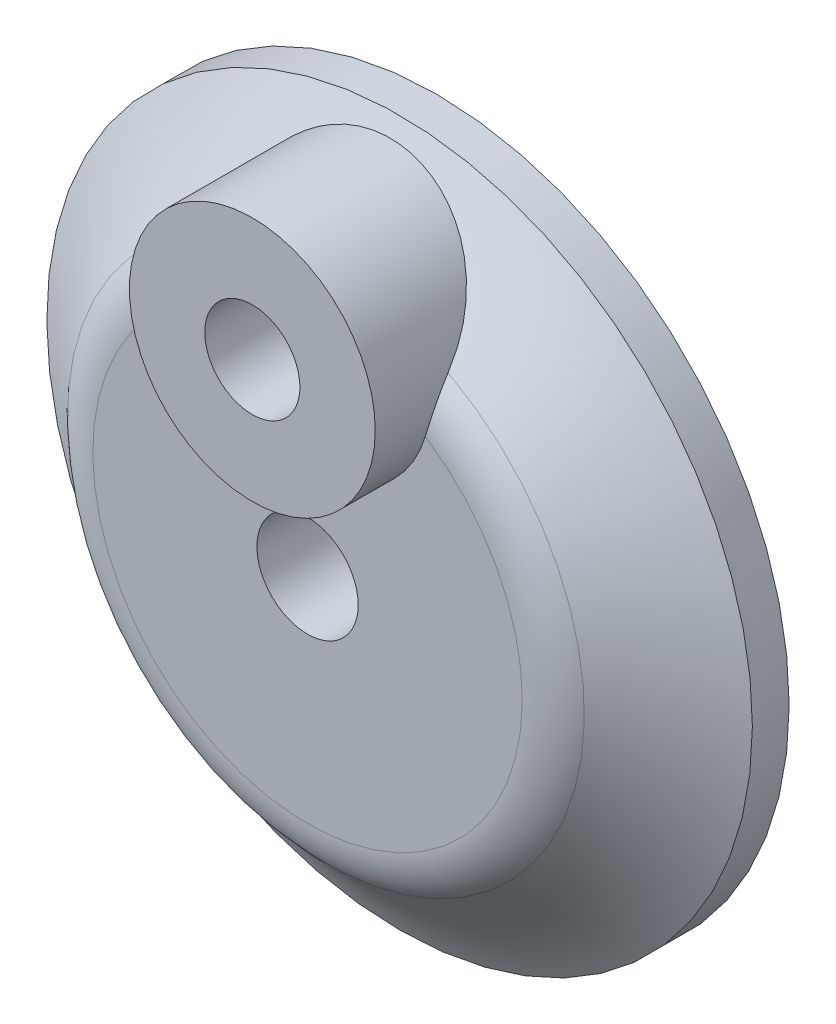
ISO-10303-21;
HEADER;
FILE_DESCRIPTION(('STEP AP214'),'2;1');
FILE_NAME('part.step','',(''),(''),'','','');
FILE_SCHEMA(('AUTOMOTIVE_DESIGN { 1 0 10303 214 1 1 1 1 }'));
ENDSEC;
DATA;
#1=APPLICATION_CONTEXT('core data for automotive mechanical design processes');
#2=APPLICATION_PROTOCOL_DEFINITION('international standard','automotive_design',2000,#1);
#3=PRODUCT_CONTEXT('',#1,'mechanical');
#4=PRODUCT('Part','Part','',(#3));
#5=PRODUCT_RELATED_PRODUCT_CATEGORY('part','',(#4));
#6=PRODUCT_DEFINITION_FORMATION('','',#4);
#7=PRODUCT_DEFINITION_CONTEXT('part definition',#1,'design');
#8=PRODUCT_DEFINITION('design','',#6,#7);
#9=PRODUCT_DEFINITION_SHAPE('','',#8);
#10=(LENGTH_UNIT() NAMED_UNIT(*) SI_UNIT(.MILLI.,.METRE.));
#11=(NAMED_UNIT(*) PLANE_ANGLE_UNIT() SI_UNIT($,.RADIAN.));
#12=(NAMED_UNIT(*) SI_UNIT($,.STERADIAN.) SOLID_ANGLE_UNIT());
#13=UNCERTAINTY_MEASURE_WITH_UNIT(LENGTH_MEASURE(1.E-05),#10,'distance_accuracy_value','');
#14=(GEOMETRIC_REPRESENTATION_CONTEXT(3) GLOBAL_UNCERTAINTY_ASSIGNED_CONTEXT((#13)) GLOBAL_UNIT_ASSIGNED_CONTEXT((#10,
#11,#12)) REPRESENTATION_CONTEXT('',''));
#15=CARTESIAN_POINT('',(0.,0.,0.));
#16=DIRECTION('',(0.,0.,1.));
#17=DIRECTION('',(1.,0.,0.));
#18=AXIS2_PLACEMENT_3D('',#15,#16,#17);
#19=CARTESIAN_POINT('',(0.,0.,2.2));
#20=DIRECTION('',(0.,0.,1.));
#21=DIRECTION('',(1.,0.,0.));
#22=AXIS2_PLACEMENT_3D('',#19,#20,#21);
#23=TOROIDAL_SURFACE('',#22,7.,2.);
#24=CARTESIAN_POINT('',(3.9840990701289,7.42481301390391,3.60212180719713));
#25=CARTESIAN_POINT('',(3.98939283972067,7.37523020038862,3.64400959690762));
#26=CARTESIAN_POINT('',(3.99391854394219,7.32394366427649,3.68397182021227));
#27=CARTESIAN_POINT('',(4.00107694189288,7.21835990945502,3.75991845799457));
#28=CARTESIAN_POINT('',(4.00370913916054,7.1640619051807,3.79590182715899));
#29=CARTESIAN_POINT('',(4.00672863940256,7.05257762712164,3.86392549929705));
#30=CARTESIAN_POINT('',(4.00710371966661,6.99537731619594,3.89594341560696));
#31=CARTESIAN_POINT('',(4.00527518987572,6.87880456675652,3.95560696700624));
#32=CARTESIAN_POINT('',(4.00307175519782,6.81943227623549,3.98325289930986));
#33=CARTESIAN_POINT('',(3.99215729215475,6.63837607624528,4.05942607614582));
#34=CARTESIAN_POINT('',(3.9791359045439,6.51392043813477,4.10108657999539));
#35=CARTESIAN_POINT('',(3.94020121406476,6.26209192301877,4.16365854874324));
#36=CARTESIAN_POINT('',(3.9143176330115,6.13472641444444,4.18461751847041));
#37=CARTESIAN_POINT('',(3.85252822664473,5.89289223391799,4.20278678907137));
#38=CARTESIAN_POINT('',(3.81773147051872,5.77829274158111,4.20196117693057));
#39=CARTESIAN_POINT('',(3.73869151830558,5.55440194292363,4.18003573237354));
#40=CARTESIAN_POINT('',(3.69445427883859,5.44510734252709,4.15894865499546));
#41=CARTESIAN_POINT('',(3.60463366045066,5.24770029372401,4.09985798739383));
#42=CARTESIAN_POINT('',(3.55977452513819,5.15859213709703,4.06404908338629));
#43=CARTESIAN_POINT('',(3.46728112520714,4.98984520877918,3.97698393089212));
#44=CARTESIAN_POINT('',(3.41964724415276,4.91020513288411,3.92572981339067));
#45=CARTESIAN_POINT('',(3.34069067644401,4.78715063190452,3.82898538683346));
#46=CARTESIAN_POINT('',(3.30931284938153,4.74060827432831,3.78743172235863));
#47=CARTESIAN_POINT('',(3.24751782112717,4.6526556203317,3.69880276546395));
#48=CARTESIAN_POINT('',(3.21709862921429,4.61123408347423,3.65174002466312));
#49=CARTESIAN_POINT('',(3.1875234423739,4.57240740615297,3.60212180719714));
#50=B_SPLINE_CURVE_WITH_KNOTS('',3,(#24,#25,#26,#27,#28,#29,#30,#31,#32,#33,#34,#35,#36,#37,#38,
#39,#40,#41,#42,#43,#44,#45,#46,#47,#48,#49),.UNSPECIFIED.,.F.,.F.,(4,2,2,2,2,2,2,2,2,2,2,2,4),
(0.,0.19530897889178,0.390669147499177,0.587086282744853,0.783490059504537,1.17687909971112,
1.56936329875143,1.92659317625421,2.28359831692732,2.60003381879346,2.91642568184105,
3.12555632419136,3.33421944191123),.UNSPECIFIED.);
#51=CARTESIAN_POINT('',(3.98412430316222,7.42457629978159,3.60232180719713));
#52=VERTEX_POINT('',#51);
#53=CARTESIAN_POINT('',(3.83909336534153,5.85332060732971,4.2));
#54=VERTEX_POINT('',#53);
#55=EDGE_CURVE('E116',#52,#54,#50,.T.);
#56=ORIENTED_EDGE('',*,*,#55,.T.);
#57=CARTESIAN_POINT('',(0.,0.,4.2));
#58=DIRECTION('',(0.,0.,1.));
#59=DIRECTION('',(1.,0.,0.));
#60=AXIS2_PLACEMENT_3D('',#57,#58,#59);
#61=CIRCLE('',#60,7.);
#62=CARTESIAN_POINT('',(-3.83909336534153,5.85332060732971,4.2));
#63=VERTEX_POINT('',#62);
#64=EDGE_CURVE('E54',#63,#54,#61,.T.);
#65=ORIENTED_EDGE('',*,*,#64,.F.);
#66=CARTESIAN_POINT('',(-3.18752344237351,4.57240740615245,3.60212180719647));
#67=CARTESIAN_POINT('',(-3.20992214008074,4.60181457932944,3.63969746710412));
#68=CARTESIAN_POINT('',(-3.23280989927579,4.63271459040017,3.67581777974334));
#69=CARTESIAN_POINT('',(-3.27921407315571,4.69742569275218,3.74492819963519));
#70=CARTESIAN_POINT('',(-3.30273063427321,4.73123746625545,3.77791756948538));
#71=CARTESIAN_POINT('',(-3.35003643480658,4.80169007926256,3.84053447880059));
#72=CARTESIAN_POINT('',(-3.37382572356332,4.83833143778838,3.87016139902881));
#73=CARTESIAN_POINT('',(-3.4212985721022,4.91427738700652,3.92583618875574));
#74=CARTESIAN_POINT('',(-3.44498214265228,4.95358169954604,3.95188443119915));
#75=CARTESIAN_POINT('',(-3.5154361289581,5.07542473580477,4.02449282372952));
#76=CARTESIAN_POINT('',(-3.56154984534769,5.1618061522499,4.06543865181468));
#77=CARTESIAN_POINT('',(-3.64914207435197,5.34248676259582,4.13127495984726));
#78=CARTESIAN_POINT('',(-3.69062495907435,5.43677833837543,4.15618069154634));
#79=CARTESIAN_POINT('',(-3.76590864994706,5.62823274035492,4.18948717326091));
#80=CARTESIAN_POINT('',(-3.79988165049485,5.72525646418351,4.1983016013999));
#81=CARTESIAN_POINT('',(-3.86027144519645,5.92185158098821,4.20125345656532));
#82=CARTESIAN_POINT('',(-3.8866846110649,6.02142417238199,4.19538384921963));
#83=CARTESIAN_POINT('',(-3.93236842484266,6.22458821473959,4.16943512823755));
#84=CARTESIAN_POINT('',(-3.9513100482262,6.32818064958055,4.14879544866983));
#85=CARTESIAN_POINT('',(-3.98071960378763,6.53298151470268,4.09396860867432));
#86=CARTESIAN_POINT('',(-3.9911808434278,6.63418800101251,4.05977078007337));
#87=CARTESIAN_POINT('',(-4.00513805855795,6.84326418740892,3.974456503327));
#88=CARTESIAN_POINT('',(-4.00771068516434,6.95058983663544,3.92186227280679));
#89=CARTESIAN_POINT('',(-4.00493503172605,7.15690285850924,3.80275009377485));
#90=CARTESIAN_POINT('',(-3.99959940773059,7.25590328671738,3.73625453859145));
#91=CARTESIAN_POINT('',(-3.9891804789829,7.37499481386107,3.64337794517912));
#92=CARTESIAN_POINT('',(-3.98673470433932,7.40012030226381,3.62298552372579));
#93=CARTESIAN_POINT('',(-3.9840990701289,7.42481301390391,3.60212180719713));
#94=B_SPLINE_CURVE_WITH_KNOTS('',3,(#66,#67,#68,#69,#70,#71,#72,#73,#74,#75,#76,#77,#78,#79,#80,
#81,#82,#83,#84,#85,#86,#87,#88,#89,#90,#91,#92,#93),.UNSPECIFIED.,.F.,.F.,(4,2,2,2,2,2,2,2,2,2,
2,2,2,4),(0.,0.158093090953232,0.316223324209178,0.474382632014001,0.632525445041574,
0.949200758211067,1.26557451383999,1.57369374139547,1.88196060141212,2.20259352001714,
2.52347922960938,2.88071766979001,3.23738501676052,3.33471081430508),.UNSPECIFIED.);
#95=CARTESIAN_POINT('',(-3.98412430316222,7.42457629978159,3.60232180719713));
#96=VERTEX_POINT('',#95);
#97=EDGE_CURVE('E66',#63,#96,#94,.T.);
#98=ORIENTED_EDGE('',*,*,#97,.T.);
#99=CARTESIAN_POINT('',(0.,0.,3.60232180719713));
#100=DIRECTION('',(0.,0.,-1.));
#101=DIRECTION('',(-1.,0.,0.));
#102=AXIS2_PLACEMENT_3D('',#99,#100,#101);
#103=CIRCLE('',#102,8.42600615323335);
#104=EDGE_CURVE('E12',#96,#52,#103,.F.);
#105=ORIENTED_EDGE('',*,*,#104,.T.);
#106=EDGE_LOOP('',(#56,#65,#98,#105));
#107=FACE_BOUND('',#106,.T.);
#108=ADVANCED_FACE('F46',(#107),#23,.T.);
#109=CARTESIAN_POINT('',(0.,0.,14.1197353611755));
#110=DIRECTION('',(0.,0.,-1.));
#111=DIRECTION('',(-1.,0.,0.));
#112=AXIS2_PLACEMENT_3D('',#109,#110,#111);
#113=TOROIDAL_SURFACE('',#112,19.1210523024835,15.);
#114=CARTESIAN_POINT('',(0.,0.,1.2));
#115=DIRECTION('',(0.,0.,1.));
#116=DIRECTION('',(1.,0.,0.));
#117=AXIS2_PLACEMENT_3D('',#114,#115,#116);
#118=CIRCLE('',#117,11.5);
#119=CARTESIAN_POINT('',(11.5,0.,1.2));
#120=VERTEX_POINT('',#119);
#121=EDGE_CURVE('E114',#120,#120,#118,.T.);
#122=ORIENTED_EDGE('',*,*,#121,.T.);
#123=EDGE_LOOP('',(#122));
#124=FACE_BOUND('',#123,.T.);
#125=ORIENTED_EDGE('',*,*,#104,.F.);
#126=CARTESIAN_POINT('',(3.98414952444802,7.42433956240811,3.60252180719713));
#127=CARTESIAN_POINT('',(3.97312394309365,7.52799237420654,3.51492171126393));
#128=CARTESIAN_POINT('',(3.95781639844434,7.63316646682494,3.42959033203094));
#129=CARTESIAN_POINT('',(3.91792035789234,7.84562239460592,3.26367524005656));
#130=CARTESIAN_POINT('',(3.89332380275433,7.95290598314825,3.18309572046455));
#131=CARTESIAN_POINT('',(3.8339771771628,8.1690897787384,3.02659362485281));
#132=CARTESIAN_POINT('',(3.7991688212009,8.27799576149179,2.95070089595225));
#133=CARTESIAN_POINT('',(3.71892090066843,8.49551698073794,2.80436032378429));
#134=CARTESIAN_POINT('',(3.67348435629954,8.60413229097856,2.73391094123851));
#135=CARTESIAN_POINT('',(3.57128931874757,8.82038240491388,2.59823022445535));
#136=CARTESIAN_POINT('',(3.51446276545493,8.92800703837552,2.53303372983878));
#137=CARTESIAN_POINT('',(3.38951501885892,9.1400559829099,2.40852429576159));
#138=CARTESIAN_POINT('',(3.32139507183207,9.24448064560881,2.34921070824892));
#139=CARTESIAN_POINT('',(3.17416359228417,9.44825456632869,2.23674803653422));
#140=CARTESIAN_POINT('',(3.09508517554899,9.54761792630408,2.18358123332226));
#141=CARTESIAN_POINT('',(2.92613397147979,9.74000592338367,2.08328823926315));
#142=CARTESIAN_POINT('',(2.83626323600468,9.83303176013692,2.03616090369033));
#143=CARTESIAN_POINT('',(2.65890378626482,9.99941885305578,1.95380624120404));
#144=CARTESIAN_POINT('',(2.57267293945498,10.0737534807452,1.91782942590905));
#145=CARTESIAN_POINT('',(2.39308046282933,10.215550068804,1.85043292064071));
#146=CARTESIAN_POINT('',(2.29971973972719,10.2830129005285,1.81901265267494));
#147=CARTESIAN_POINT('',(2.10648943730017,10.4102200018941,1.76069367758889));
#148=CARTESIAN_POINT('',(2.00661721885789,10.4699611122856,1.73379681982089));
#149=CARTESIAN_POINT('',(1.80118028800776,10.5809057944539,1.6845086545592));
#150=CARTESIAN_POINT('',(1.69561590867673,10.6321098650598,1.66211708380061));
#151=CARTESIAN_POINT('',(1.48902123800136,10.7212726878023,1.62354614294287));
#152=CARTESIAN_POINT('',(1.388388043428,10.7599938580549,1.6069970529024));
#153=CARTESIAN_POINT('',(1.18380155748127,10.8293332957,1.57759319742423));
#154=CARTESIAN_POINT('',(1.07984719534939,10.8599489196744,1.5647396370726));
#155=CARTESIAN_POINT('',(0.869516587341932,10.9126971444923,1.54271848603533));
#156=CARTESIAN_POINT('',(0.76314237122921,10.9348365959527,1.5335479183844));
#157=CARTESIAN_POINT('',(0.548660155345765,10.9704287456928,1.51885513570011));
#158=CARTESIAN_POINT('',(0.44055154195544,10.9838782968363,1.51333424241688));
#159=CARTESIAN_POINT('',(0.227351577063893,11.001606436935,1.50606562331004));
#160=CARTESIAN_POINT('',(0.122290222565608,11.0061951654697,1.50419028212472));
#161=CARTESIAN_POINT('',(-0.0879128345772397,11.0070978022041,1.50382102741601));
#162=CARTESIAN_POINT('',(-0.193054552525234,11.0034087410616,1.50532832728647));
#163=CARTESIAN_POINT('',(-0.402573714043989,10.9877909785977,1.51172884850578));
#164=CARTESIAN_POINT('',(-0.506951470473042,10.9758658658246,1.51662059521139));
#165=CARTESIAN_POINT('',(-0.714278134415034,10.9438970247593,1.52980142312946));
#166=CARTESIAN_POINT('',(-0.817226500448106,10.9238503022008,1.53809175734285));
#167=CARTESIAN_POINT('',(-1.02016574014749,10.8760238214022,1.55801242066859));
#168=CARTESIAN_POINT('',(-1.12017289528071,10.8483025731791,1.56961749885683));
#169=CARTESIAN_POINT('',(-1.31736638669289,10.7853366794875,1.59621754247744));
#170=CARTESIAN_POINT('',(-1.41455168809198,10.7500893125271,1.61121373427399));
#171=CARTESIAN_POINT('',(-1.60538728761235,10.6724449294603,1.6446140589959));
#172=CARTESIAN_POINT('',(-1.6990384528832,10.6300496813298,1.66301734931055));
#173=CARTESIAN_POINT('',(-1.88225694312912,10.5385184657252,1.70326586894596));
#174=CARTESIAN_POINT('',(-1.97182273446091,10.4893799941557,1.72511237735513));
#175=CARTESIAN_POINT('',(-2.14762960488104,10.3840587875437,1.77263216714687));
#176=CARTESIAN_POINT('',(-2.23379824329035,10.327779225717,1.79835919903478));
#177=CARTESIAN_POINT('',(-2.4008216418484,10.2093718758135,1.85340166873663));
#178=CARTESIAN_POINT('',(-2.48167444459963,10.1472419537715,1.88271841710828));
#179=CARTESIAN_POINT('',(-2.71542642802291,9.9531111108106,1.97603317715444));
#180=CARTESIAN_POINT('',(-2.85977621439407,9.81321330195214,2.04546430505766));
#181=CARTESIAN_POINT('',(-3.12839071299627,9.51182015514246,2.20193679050318));
#182=CARTESIAN_POINT('',(-3.25152703114066,9.349655433127,2.28960623319408));
#183=CARTESIAN_POINT('',(-3.46895344840415,9.01488212783237,2.4804339635848));
#184=CARTESIAN_POINT('',(-3.56318845513042,8.84225434025959,2.58362128090557));
#185=CARTESIAN_POINT('',(-3.69074610526239,8.56367746253374,2.76002780387761));
#186=CARTESIAN_POINT('',(-3.73331775051039,8.45886453961482,2.82858662947265));
#187=CARTESIAN_POINT('',(-3.80864745967701,8.24905103333252,2.97076585154155));
#188=CARTESIAN_POINT('',(-3.84140129657317,8.14405038866189,3.04438841146445));
#189=CARTESIAN_POINT('',(-3.89746899362394,7.93535642436514,3.19620521412408));
#190=CARTESIAN_POINT('',(-3.92080985630418,7.83166020395775,3.27438563273526));
#191=CARTESIAN_POINT('',(-3.95881211692024,7.62628476153741,3.43517963671658));
#192=CARTESIAN_POINT('',(-3.97348170644438,7.52460372388435,3.51778895744273));
#193=CARTESIAN_POINT('',(-3.98414952444802,7.42433956240812,3.60252180719713));
#194=B_SPLINE_CURVE_WITH_KNOTS('',3,(#126,#127,#128,#129,#130,#131,#132,#133,#134,#135,#136,
#137,#138,#139,#140,#141,#142,#143,#144,#145,#146,#147,#148,#149,#150,#151,#152,#153,#154,#155,
#156,#157,#158,#159,#160,#161,#162,#163,#164,#165,#166,#167,#168,#169,#170,#171,#172,#173,#174,
#175,#176,#177,#178,#179,#180,#181,#182,#183,#184,#185,#186,#187,#188,#189,#190,#191,#192,#193),
.UNSPECIFIED.,.F.,.F.,(4,2,2,2,2,2,2,2,2,2,2,2,2,2,2,2,2,2,2,2,2,2,2,2,2,2,2,2,2,2,2,2,2,4),(0.,
0.408451176462131,0.817257546292971,1.22844421299409,1.63951417483813,2.05311789453385,
2.4666760015539,2.87901056260923,3.29126685347409,3.64898211263885,4.00665195629846,
4.36446767616973,4.72226248112673,5.04912273118162,5.37608944747306,5.70279134185891,
6.02961148845248,6.34476902982038,6.66003964004119,6.97517296959234,7.29042258803756,
7.60333198686769,7.91635472791119,8.22930015835583,8.542362117129,8.86024516251772,
9.17824461075724,9.81332951356197,10.4756807108395,11.1392867613513,11.5357219692068,
11.9323276164717,12.327787306811,12.7228728143037),.UNSPECIFIED.);
#195=EDGE_CURVE('E60',#52,#96,#194,.T.);
#196=ORIENTED_EDGE('',*,*,#195,.F.);
#197=EDGE_LOOP('',(#125,#196));
#198=FACE_BOUND('',#197,.T.);
#199=ADVANCED_FACE('F48',(#124,#198),#113,.F.);
#200=CARTESIAN_POINT('',(0.,0.,0.));
#201=DIRECTION('',(0.,0.,1.));
#202=DIRECTION('',(1.,0.,0.));
#203=AXIS2_PLACEMENT_3D('',#200,#201,#202);
#204=PLANE('',#203);
#205=DIRECTION('',(0.502160373992522,-0.864774513264406,0.));
#206=VECTOR('',#205,1.);
#207=CARTESIAN_POINT('',(1.63832844556586,9.85409879024006,0.));
#208=LINE('',#207,#206);
#209=CARTESIAN_POINT('',(1.63832844556586,9.85409879024006,0.));
#210=VERTEX_POINT('',#209);
#211=CARTESIAN_POINT('',(3.29088628004125,7.00821534151732,0.));
#212=VERTEX_POINT('',#211);
#213=EDGE_CURVE('E230',#210,#212,#208,.T.);
#214=ORIENTED_EDGE('',*,*,#213,.F.);
#215=DIRECTION('',(0.99999688402856,0.0024963840192161,0.));
#216=VECTOR('',#215,1.);
#217=CARTESIAN_POINT('',(-1.65255783447539,9.84588344872274,0.));
#218=LINE('',#217,#216);
#219=CARTESIAN_POINT('',(-1.65255783447539,9.84588344872274,0.));
#220=VERTEX_POINT('',#219);
#221=EDGE_CURVE('E223',#220,#210,#218,.T.);
#222=ORIENTED_EDGE('',*,*,#221,.F.);
#223=DIRECTION('',(0.497836510036037,0.867270897283622,0.));
#224=VECTOR('',#223,1.);
#225=CARTESIAN_POINT('',(-3.29088628004125,6.99178465848268,0.));
#226=LINE('',#225,#224);
#227=CARTESIAN_POINT('',(-3.29088628004125,6.99178465848268,0.));
#228=VERTEX_POINT('',#227);
#229=EDGE_CURVE('E242',#228,#220,#226,.T.);
#230=ORIENTED_EDGE('',*,*,#229,.F.);
#231=DIRECTION('',(-0.502160373992522,0.864774513264406,0.));
#232=VECTOR('',#231,1.);
#233=CARTESIAN_POINT('',(-1.63832844556586,4.14590120975994,0.));
#234=LINE('',#233,#232);
#235=CARTESIAN_POINT('',(-1.63832844556586,4.14590120975994,0.));
#236=VERTEX_POINT('',#235);
#237=EDGE_CURVE('E239',#236,#228,#234,.T.);
#238=ORIENTED_EDGE('',*,*,#237,.F.);
#239=DIRECTION('',(-0.99999688402856,-0.00249638401921636,0.));
#240=VECTOR('',#239,1.);
#241=CARTESIAN_POINT('',(1.65255783447539,4.15411655127727,0.));
#242=LINE('',#241,#240);
#243=CARTESIAN_POINT('',(1.65255783447539,4.15411655127727,0.));
#244=VERTEX_POINT('',#243);
#245=EDGE_CURVE('E236',#244,#236,#242,.T.);
#246=ORIENTED_EDGE('',*,*,#245,.F.);
#247=DIRECTION('',(-0.497836510036037,-0.867270897283622,0.));
#248=VECTOR('',#247,1.);
#249=CARTESIAN_POINT('',(3.29088628004125,7.00821534151732,0.));
#250=LINE('',#249,#248);
#251=EDGE_CURVE('E233',#212,#244,#250,.T.);
#252=ORIENTED_EDGE('',*,*,#251,.F.);
#253=EDGE_LOOP('',(#214,#222,#230,#238,#246,#252));
#254=FACE_BOUND('',#253,.T.);
#255=CARTESIAN_POINT('',(0.,0.,0.));
#256=DIRECTION('',(0.,0.,1.));
#257=DIRECTION('',(1.,0.,0.));
#258=AXIS2_PLACEMENT_3D('',#255,#256,#257);
#259=CIRCLE('',#258,11.5);
#260=CARTESIAN_POINT('',(11.5,0.,0.));
#261=VERTEX_POINT('',#260);
#262=EDGE_CURVE('E264',#261,#261,#259,.T.);
#263=ORIENTED_EDGE('',*,*,#262,.F.);
#264=EDGE_LOOP('',(#263));
#265=FACE_BOUND('',#264,.T.);
#266=CARTESIAN_POINT('',(0.,0.,0.));
#267=DIRECTION('',(0.,0.,1.));
#268=DIRECTION('',(1.,0.,0.));
#269=AXIS2_PLACEMENT_3D('',#266,#267,#268);
#270=CIRCLE('',#269,1.65);
#271=CARTESIAN_POINT('',(1.65,0.,0.));
#272=VERTEX_POINT('',#271);
#273=EDGE_CURVE('E261',#272,#272,#270,.T.);
#274=ORIENTED_EDGE('',*,*,#273,.T.);
#275=EDGE_LOOP('',(#274));
#276=FACE_BOUND('',#275,.T.);
#277=ADVANCED_FACE('F165',(#254,#265,#276),#204,.F.);
#278=CARTESIAN_POINT('',(0.,0.,1.2));
#279=DIRECTION('',(0.,0.,-1.));
#280=DIRECTION('',(-1.,0.,0.));
#281=AXIS2_PLACEMENT_3D('',#278,#279,#280);
#282=CYLINDRICAL_SURFACE('',#281,11.5);
#283=ORIENTED_EDGE('',*,*,#121,.F.);
#284=EDGE_LOOP('',(#283));
#285=FACE_BOUND('',#284,.T.);
#286=ORIENTED_EDGE('',*,*,#262,.T.);
#287=EDGE_LOOP('',(#286));
#288=FACE_BOUND('',#287,.T.);
#289=ADVANCED_FACE('F168',(#285,#288),#282,.T.);
#290=CARTESIAN_POINT('',(0.,0.,1.2));
#291=DIRECTION('',(0.,0.,-1.));
#292=DIRECTION('',(-1.,0.,0.));
#293=AXIS2_PLACEMENT_3D('',#290,#291,#292);
#294=CYLINDRICAL_SURFACE('',#293,1.65);
#295=ORIENTED_EDGE('',*,*,#273,.F.);
#296=EDGE_LOOP('',(#295));
#297=FACE_BOUND('',#296,.T.);
#298=CARTESIAN_POINT('',(0.,0.,4.2));
#299=DIRECTION('',(0.,0.,1.));
#300=DIRECTION('',(1.,0.,0.));
#301=AXIS2_PLACEMENT_3D('',#298,#299,#300);
#302=CIRCLE('',#301,1.65);
#303=CARTESIAN_POINT('',(1.65,0.,4.2));
#304=VERTEX_POINT('',#303);
#305=EDGE_CURVE('E248',#304,#304,#302,.T.);
#306=ORIENTED_EDGE('',*,*,#305,.T.);
#307=EDGE_LOOP('',(#306));
#308=FACE_BOUND('',#307,.T.);
#309=ADVANCED_FACE('F171',(#297,#308),#294,.F.);
#310=CARTESIAN_POINT('',(0.,0.,4.2));
#311=DIRECTION('',(0.,0.,1.));
#312=DIRECTION('',(1.,0.,0.));
#313=AXIS2_PLACEMENT_3D('',#310,#311,#312);
#314=PLANE('',#313);
#315=CARTESIAN_POINT('',(0.,7.,4.2));
#316=DIRECTION('',(0.,0.,1.));
#317=DIRECTION('',(1.,0.,0.));
#318=AXIS2_PLACEMENT_3D('',#315,#316,#317);
#319=CIRCLE('',#318,4.00668335377081);
#320=EDGE_CURVE('E113',#54,#63,#319,.F.);
#321=ORIENTED_EDGE('',*,*,#320,.T.);
#322=ORIENTED_EDGE('',*,*,#64,.T.);
#323=EDGE_LOOP('',(#321,#322));
#324=FACE_BOUND('',#323,.T.);
#325=ORIENTED_EDGE('',*,*,#305,.F.);
#326=EDGE_LOOP('',(#325));
#327=FACE_BOUND('',#326,.T.);
#328=ADVANCED_FACE('F110',(#324,#327),#314,.T.);
#329=CARTESIAN_POINT('',(-1.65255783447539,9.84588344872274,3.));
#330=DIRECTION('',(-0.0024963840192161,0.99999688402856,0.));
#331=DIRECTION('',(-0.99999688402856,-0.0024963840192161,0.));
#332=AXIS2_PLACEMENT_3D('',#329,#330,#331);
#333=PLANE('',#332);
#334=DIRECTION('',(0.,0.,-1.));
#335=VECTOR('',#334,1.);
#336=CARTESIAN_POINT('',(1.63832844556586,9.85409879024006,3.));
#337=LINE('',#336,#335);
#338=CARTESIAN_POINT('',(1.63832844556588,9.85409879024004,2.3));
#339=VERTEX_POINT('',#338);
#340=EDGE_CURVE('E245',#339,#210,#337,.T.);
#341=ORIENTED_EDGE('',*,*,#340,.F.);
#342=DIRECTION('',(0.99999688402856,0.00249638401920871,0.));
#343=VECTOR('',#342,1.);
#344=CARTESIAN_POINT('',(-0.0245893281385767,9.8499474959492,2.3));
#345=LINE('',#344,#343);
#346=CARTESIAN_POINT('',(-1.65255783447537,9.84588344872275,2.3));
#347=VERTEX_POINT('',#346);
#348=EDGE_CURVE('E290',#347,#339,#345,.T.);
#349=ORIENTED_EDGE('',*,*,#348,.F.);
#350=DIRECTION('',(0.,0.,-1.));
#351=VECTOR('',#350,1.);
#352=CARTESIAN_POINT('',(-1.65255783447539,9.84588344872274,3.));
#353=LINE('',#352,#351);
#354=EDGE_CURVE('E246',#347,#220,#353,.T.);
#355=ORIENTED_EDGE('',*,*,#354,.T.);
#356=ORIENTED_EDGE('',*,*,#221,.T.);
#357=EDGE_LOOP('',(#341,#349,#355,#356));
#358=FACE_BOUND('',#357,.T.);
#359=ADVANCED_FACE('F181',(#358),#333,.F.);
#360=CARTESIAN_POINT('',(-3.29088628004125,6.99178465848268,3.));
#361=DIRECTION('',(-0.867270897283622,0.497836510036037,0.));
#362=DIRECTION('',(-0.497836510036037,-0.867270897283622,0.));
#363=AXIS2_PLACEMENT_3D('',#360,#361,#362);
#364=PLANE('',#363);
#365=ORIENTED_EDGE('',*,*,#354,.F.);
#366=DIRECTION('',(0.497836510036044,0.867270897283618,0.));
#367=VECTOR('',#366,1.);
#368=CARTESIAN_POINT('',(-5.49403587457484,3.1537223886768,2.3));
#369=LINE('',#368,#367);
#370=CARTESIAN_POINT('',(-3.29088628004125,6.99178465848268,2.3));
#371=VERTEX_POINT('',#370);
#372=EDGE_CURVE('E122',#371,#347,#369,.T.);
#373=ORIENTED_EDGE('',*,*,#372,.F.);
#374=DIRECTION('',(0.,0.,-1.));
#375=VECTOR('',#374,1.);
#376=CARTESIAN_POINT('',(-3.29088628004125,6.99178465848268,3.));
#377=LINE('',#376,#375);
#378=EDGE_CURVE('E249',#371,#228,#377,.T.);
#379=ORIENTED_EDGE('',*,*,#378,.T.);
#380=ORIENTED_EDGE('',*,*,#229,.T.);
#381=EDGE_LOOP('',(#365,#373,#379,#380));
#382=FACE_BOUND('',#381,.T.);
#383=ADVANCED_FACE('F184',(#382),#364,.F.);
#384=CARTESIAN_POINT('',(1.63832844556586,9.85409879024006,3.));
#385=DIRECTION('',(0.864774513264406,0.502160373992522,0.));
#386=DIRECTION('',(-0.502160373992522,0.864774513264406,0.));
#387=AXIS2_PLACEMENT_3D('',#384,#385,#386);
#388=PLANE('',#387);
#389=DIRECTION('',(0.,0.,-1.));
#390=VECTOR('',#389,1.);
#391=CARTESIAN_POINT('',(3.29088628004125,7.00821534151732,3.));
#392=LINE('',#391,#390);
#393=CARTESIAN_POINT('',(3.29088628004125,7.00821534151732,2.3));
#394=VERTEX_POINT('',#393);
#395=EDGE_CURVE('E255',#394,#212,#392,.T.);
#396=ORIENTED_EDGE('',*,*,#395,.F.);
#397=DIRECTION('',(0.502160373992516,-0.86477451326441,0.));
#398=VECTOR('',#397,1.);
#399=CARTESIAN_POINT('',(5.50439581380393,3.19631235433679,2.3));
#400=LINE('',#399,#398);
#401=EDGE_CURVE('E280',#339,#394,#400,.T.);
#402=ORIENTED_EDGE('',*,*,#401,.F.);
#403=ORIENTED_EDGE('',*,*,#340,.T.);
#404=ORIENTED_EDGE('',*,*,#213,.T.);
#405=EDGE_LOOP('',(#396,#402,#403,#404));
#406=FACE_BOUND('',#405,.T.);
#407=ADVANCED_FACE('F186',(#406),#388,.F.);
#408=CARTESIAN_POINT('',(-1.63832844556586,4.14590120975994,3.));
#409=DIRECTION('',(-0.864774513264406,-0.502160373992522,0.));
#410=DIRECTION('',(0.502160373992522,-0.864774513264406,0.));
#411=AXIS2_PLACEMENT_3D('',#408,#409,#410);
#412=PLANE('',#411);
#413=ORIENTED_EDGE('',*,*,#378,.F.);
#414=DIRECTION('',(-0.502160373992522,0.864774513264406,0.));
#415=VECTOR('',#414,1.);
#416=CARTESIAN_POINT('',(0.575181088196834,0.333998222579482,2.3));
#417=LINE('',#416,#415);
#418=CARTESIAN_POINT('',(-1.63832844556586,4.14590120975995,2.3));
#419=VERTEX_POINT('',#418);
#420=EDGE_CURVE('E220',#419,#371,#417,.T.);
#421=ORIENTED_EDGE('',*,*,#420,.F.);
#422=DIRECTION('',(0.,0.,-1.));
#423=VECTOR('',#422,1.);
#424=CARTESIAN_POINT('',(-1.63832844556586,4.14590120975994,3.));
#425=LINE('',#424,#423);
#426=EDGE_CURVE('E251',#419,#236,#425,.T.);
#427=ORIENTED_EDGE('',*,*,#426,.T.);
#428=ORIENTED_EDGE('',*,*,#237,.T.);
#429=EDGE_LOOP('',(#413,#421,#427,#428));
#430=FACE_BOUND('',#429,.T.);
#431=ADVANCED_FACE('F189',(#430),#412,.F.);
#432=CARTESIAN_POINT('',(1.65255783447539,4.15411655127727,3.));
#433=DIRECTION('',(0.00249638401921636,-0.99999688402856,0.));
#434=DIRECTION('',(0.99999688402856,0.00249638401921636,0.));
#435=AXIS2_PLACEMENT_3D('',#432,#433,#434);
#436=PLANE('',#435);
#437=ORIENTED_EDGE('',*,*,#426,.F.);
#438=DIRECTION('',(-0.99999688402856,-0.00249638401921636,0.));
#439=VECTOR('',#438,1.);
#440=CARTESIAN_POINT('',(-0.0103599392291187,4.14996525698641,2.3));
#441=LINE('',#440,#439);
#442=CARTESIAN_POINT('',(1.65255783447539,4.15411655127727,2.3));
#443=VERTEX_POINT('',#442);
#444=EDGE_CURVE('E225',#443,#419,#441,.T.);
#445=ORIENTED_EDGE('',*,*,#444,.F.);
#446=DIRECTION('',(0.,0.,-1.));
#447=VECTOR('',#446,1.);
#448=CARTESIAN_POINT('',(1.65255783447539,4.15411655127727,3.));
#449=LINE('',#448,#447);
#450=EDGE_CURVE('E253',#443,#244,#449,.T.);
#451=ORIENTED_EDGE('',*,*,#450,.T.);
#452=ORIENTED_EDGE('',*,*,#245,.T.);
#453=EDGE_LOOP('',(#437,#445,#451,#452));
#454=FACE_BOUND('',#453,.T.);
#455=ADVANCED_FACE('F194',(#454),#436,.F.);
#456=CARTESIAN_POINT('',(3.29088628004125,7.00821534151732,3.));
#457=DIRECTION('',(0.867270897283622,-0.497836510036037,0.));
#458=DIRECTION('',(0.497836510036037,0.867270897283622,0.));
#459=AXIS2_PLACEMENT_3D('',#456,#457,#458);
#460=PLANE('',#459);
#461=ORIENTED_EDGE('',*,*,#450,.F.);
#462=DIRECTION('',(-0.497836510036037,-0.867270897283622,0.));
#463=VECTOR('',#462,1.);
#464=CARTESIAN_POINT('',(-0.550591760058185,0.316054281471325,2.3));
#465=LINE('',#464,#463);
#466=EDGE_CURVE('E287',#394,#443,#465,.T.);
#467=ORIENTED_EDGE('',*,*,#466,.F.);
#468=ORIENTED_EDGE('',*,*,#395,.T.);
#469=ORIENTED_EDGE('',*,*,#251,.T.);
#470=EDGE_LOOP('',(#461,#467,#468,#469));
#471=FACE_BOUND('',#470,.T.);
#472=ADVANCED_FACE('F191',(#471),#460,.F.);
#473=CARTESIAN_POINT('',(0.,0.,6.));
#474=DIRECTION('',(0.,0.,-1.));
#475=DIRECTION('',(-1.,0.,0.));
#476=AXIS2_PLACEMENT_3D('',#473,#474,#475);
#477=PLANE('',#476);
#478=CARTESIAN_POINT('',(0.,7.,6.));
#479=DIRECTION('',(0.,0.,-1.));
#480=DIRECTION('',(-1.,0.,0.));
#481=AXIS2_PLACEMENT_3D('',#478,#479,#480);
#482=CIRCLE('',#481,1.55);
#483=CARTESIAN_POINT('',(-1.55,7.,6.));
#484=VERTEX_POINT('',#483);
#485=EDGE_CURVE('E219',#484,#484,#482,.F.);
#486=ORIENTED_EDGE('',*,*,#485,.F.);
#487=EDGE_LOOP('',(#486));
#488=FACE_BOUND('',#487,.T.);
#489=CARTESIAN_POINT('',(0.,7.,6.));
#490=DIRECTION('',(0.,0.,1.));
#491=DIRECTION('',(1.,0.,0.));
#492=AXIS2_PLACEMENT_3D('',#489,#490,#491);
#493=CIRCLE('',#492,4.00668335377081);
#494=CARTESIAN_POINT('',(4.00668335377081,7.,6.));
#495=VERTEX_POINT('',#494);
#496=EDGE_CURVE('E148',#495,#495,#493,.T.);
#497=ORIENTED_EDGE('',*,*,#496,.T.);
#498=EDGE_LOOP('',(#497));
#499=FACE_BOUND('',#498,.T.);
#500=ADVANCED_FACE('F152',(#488,#499),#477,.F.);
#501=CARTESIAN_POINT('',(0.,0.,2.3));
#502=DIRECTION('',(0.,0.,-1.));
#503=DIRECTION('',(-1.,0.,0.));
#504=AXIS2_PLACEMENT_3D('',#501,#502,#503);
#505=PLANE('',#504);
#506=ORIENTED_EDGE('',*,*,#372,.T.);
#507=ORIENTED_EDGE('',*,*,#348,.T.);
#508=ORIENTED_EDGE('',*,*,#401,.T.);
#509=ORIENTED_EDGE('',*,*,#466,.T.);
#510=ORIENTED_EDGE('',*,*,#444,.T.);
#511=ORIENTED_EDGE('',*,*,#420,.T.);
#512=EDGE_LOOP('',(#506,#507,#508,#509,#510,#511));
#513=FACE_BOUND('',#512,.T.);
#514=CARTESIAN_POINT('',(0.,7.,2.3));
#515=DIRECTION('',(0.,0.,-1.));
#516=DIRECTION('',(-1.,0.,0.));
#517=AXIS2_PLACEMENT_3D('',#514,#515,#516);
#518=CIRCLE('',#517,1.55);
#519=CARTESIAN_POINT('',(-1.55,7.,2.3));
#520=VERTEX_POINT('',#519);
#521=EDGE_CURVE('E218',#520,#520,#518,.F.);
#522=ORIENTED_EDGE('',*,*,#521,.T.);
#523=EDGE_LOOP('',(#522));
#524=FACE_BOUND('',#523,.T.);
#525=ADVANCED_FACE('F158',(#513,#524),#505,.T.);
#526=CARTESIAN_POINT('',(0.,7.,-3.));
#527=DIRECTION('',(0.,0.,1.));
#528=DIRECTION('',(1.,0.,0.));
#529=AXIS2_PLACEMENT_3D('',#526,#527,#528);
#530=CYLINDRICAL_SURFACE('',#529,1.55);
#531=ORIENTED_EDGE('',*,*,#521,.F.);
#532=EDGE_LOOP('',(#531));
#533=FACE_BOUND('',#532,.T.);
#534=ORIENTED_EDGE('',*,*,#485,.T.);
#535=EDGE_LOOP('',(#534));
#536=FACE_BOUND('',#535,.T.);
#537=ADVANCED_FACE('F154',(#533,#536),#530,.F.);
#538=CARTESIAN_POINT('',(0.,7.,-0.00200000000000027));
#539=DIRECTION('',(0.,0.,1.));
#540=DIRECTION('',(1.,0.,0.));
#541=AXIS2_PLACEMENT_3D('',#538,#539,#540);
#542=CYLINDRICAL_SURFACE('',#541,4.00668335377081);
#543=ORIENTED_EDGE('',*,*,#55,.F.);
#544=ORIENTED_EDGE('',*,*,#195,.T.);
#545=ORIENTED_EDGE('',*,*,#97,.F.);
#546=ORIENTED_EDGE('',*,*,#320,.F.);
#547=EDGE_LOOP('',(#543,#544,#545,#546));
#548=FACE_BOUND('',#547,.T.);
#549=ORIENTED_EDGE('',*,*,#496,.F.);
#550=EDGE_LOOP('',(#549));
#551=FACE_BOUND('',#550,.T.);
#552=ADVANCED_FACE('F119',(#548,#551),#542,.T.);
#553=CLOSED_SHELL('',(#108,#199,#277,#289,#309,#328,#359,#383,#407,#431,#455,#472,#500,#525,
#537,#552));
#554=MANIFOLD_SOLID_BREP('B2',#553);
#555=ADVANCED_BREP_SHAPE_REPRESENTATION('',(#18,#554),#14);
#556=SHAPE_DEFINITION_REPRESENTATION(#9,#555);
ENDSEC;
END-ISO-10303-21;
